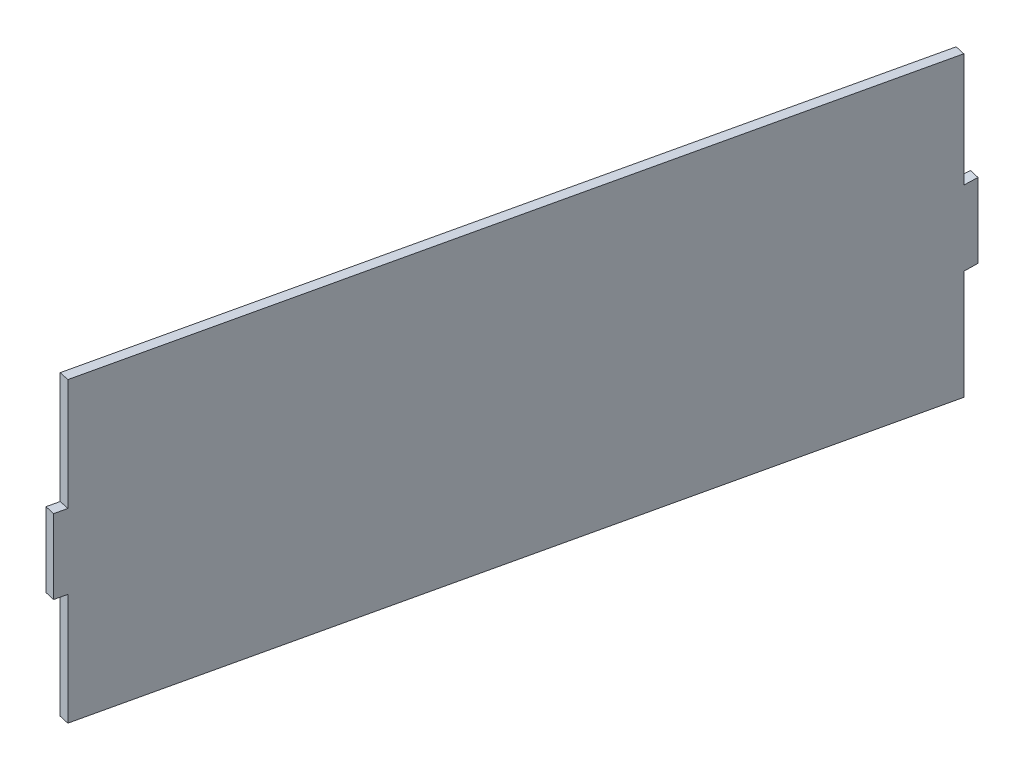
ISO-10303-21;
HEADER;
FILE_DESCRIPTION(('STEP AP214'),'2;1');
FILE_NAME('part.step','',(''),(''),'','','');
FILE_SCHEMA(('AUTOMOTIVE_DESIGN { 1 0 10303 214 1 1 1 1 }'));
ENDSEC;
DATA;
#1=APPLICATION_CONTEXT('core data for automotive mechanical design processes');
#2=APPLICATION_PROTOCOL_DEFINITION('international standard','automotive_design',2000,#1);
#3=PRODUCT_CONTEXT('',#1,'mechanical');
#4=PRODUCT('Part','Part','',(#3));
#5=PRODUCT_RELATED_PRODUCT_CATEGORY('part','',(#4));
#6=PRODUCT_DEFINITION_FORMATION('','',#4);
#7=PRODUCT_DEFINITION_CONTEXT('part definition',#1,'design');
#8=PRODUCT_DEFINITION('design','',#6,#7);
#9=PRODUCT_DEFINITION_SHAPE('','',#8);
#10=(LENGTH_UNIT() NAMED_UNIT(*) SI_UNIT(.MILLI.,.METRE.));
#11=(NAMED_UNIT(*) PLANE_ANGLE_UNIT() SI_UNIT($,.RADIAN.));
#12=(NAMED_UNIT(*) SI_UNIT($,.STERADIAN.) SOLID_ANGLE_UNIT());
#13=UNCERTAINTY_MEASURE_WITH_UNIT(LENGTH_MEASURE(1.E-05),#10,'distance_accuracy_value','');
#14=(GEOMETRIC_REPRESENTATION_CONTEXT(3) GLOBAL_UNCERTAINTY_ASSIGNED_CONTEXT((#13)) GLOBAL_UNIT_ASSIGNED_CONTEXT((#10,
#11,#12)) REPRESENTATION_CONTEXT('',''));
#15=CARTESIAN_POINT('',(0.,0.,0.));
#16=DIRECTION('',(0.,0.,1.));
#17=DIRECTION('',(1.,0.,0.));
#18=AXIS2_PLACEMENT_3D('',#15,#16,#17);
#19=CARTESIAN_POINT('',(242.285696399217,-154.081628831697,2778.09674090437));
#20=DIRECTION('',(0.,1.,0.));
#21=DIRECTION('',(-1.,0.,0.));
#22=AXIS2_PLACEMENT_3D('',#19,#20,#21);
#23=PLANE('',#22);
#24=DIRECTION('',(0.221396263565467,0.,-0.975183928538227));
#25=VECTOR('',#24,1.);
#26=CARTESIAN_POINT('',(252.193565113166,-154.081628831697,2780.34612694219));
#27=LINE('',#26,#25);
#28=CARTESIAN_POINT('',(249.53680995038,-154.081628831697,2792.04833408465));
#29=VERTEX_POINT('',#28);
#30=CARTESIAN_POINT('',(252.193565113166,-154.081628831697,2780.34612694219));
#31=VERTEX_POINT('',#30);
#32=EDGE_CURVE('E159',#29,#31,#27,.T.);
#33=ORIENTED_EDGE('',*,*,#32,.T.);
#34=DIRECTION('',(0.975183928538226,0.,0.221396263565471));
#35=VECTOR('',#34,1.);
#36=CARTESIAN_POINT('',(242.285696399217,-154.081628831697,2778.09674090437));
#37=LINE('',#36,#35);
#38=CARTESIAN_POINT('',(242.285696399217,-154.081628831697,2778.09674090437));
#39=VERTEX_POINT('',#38);
#40=EDGE_CURVE('E42',#39,#31,#37,.T.);
#41=ORIENTED_EDGE('',*,*,#40,.F.);
#42=DIRECTION('',(0.221396263565467,0.,-0.975183928538227));
#43=VECTOR('',#42,1.);
#44=CARTESIAN_POINT('',(242.285696399217,-154.081628831697,2778.09674090437));
#45=LINE('',#44,#43);
#46=CARTESIAN_POINT('',(239.628941236432,-154.081628831697,2789.79894804683));
#47=VERTEX_POINT('',#46);
#48=EDGE_CURVE('E180',#47,#39,#45,.T.);
#49=ORIENTED_EDGE('',*,*,#48,.F.);
#50=DIRECTION('',(0.975183928538226,0.,0.221396263565471));
#51=VECTOR('',#50,1.);
#52=CARTESIAN_POINT('',(239.628941236432,-154.081628831697,2789.79894804683));
#53=LINE('',#52,#51);
#54=EDGE_CURVE('E11',#47,#29,#53,.T.);
#55=ORIENTED_EDGE('',*,*,#54,.T.);
#56=EDGE_LOOP('',(#33,#41,#49,#55));
#57=FACE_BOUND('',#56,.T.);
#58=ADVANCED_FACE('F39',(#57),#23,.T.);
#59=CARTESIAN_POINT('',(239.628941236432,-154.081628831697,2789.79894804683));
#60=DIRECTION('',(-0.221396263565471,0.,0.975183928538226));
#61=DIRECTION('',(-0.975183928538226,0.,-0.221396263565471));
#62=AXIS2_PLACEMENT_3D('',#59,#60,#61);
#63=PLANE('',#62);
#64=DIRECTION('',(0.,1.,0.));
#65=VECTOR('',#64,1.);
#66=CARTESIAN_POINT('',(249.53680995038,-154.081628831697,2792.04833408465));
#67=LINE('',#66,#65);
#68=CARTESIAN_POINT('',(249.53680995038,-229.081628831698,2792.04833408465));
#69=VERTEX_POINT('',#68);
#70=EDGE_CURVE('E104',#69,#29,#67,.T.);
#71=ORIENTED_EDGE('',*,*,#70,.T.);
#72=ORIENTED_EDGE('',*,*,#54,.F.);
#73=DIRECTION('',(0.,1.,0.));
#74=VECTOR('',#73,1.);
#75=CARTESIAN_POINT('',(239.628941236432,-154.081628831697,2789.79894804683));
#76=LINE('',#75,#74);
#77=CARTESIAN_POINT('',(239.628941236432,-229.081628831698,2789.79894804683));
#78=VERTEX_POINT('',#77);
#79=EDGE_CURVE('E57',#78,#47,#76,.T.);
#80=ORIENTED_EDGE('',*,*,#79,.F.);
#81=DIRECTION('',(0.975183928538226,0.,0.221396263565471));
#82=VECTOR('',#81,1.);
#83=CARTESIAN_POINT('',(239.628941236432,-229.081628831698,2789.79894804683));
#84=LINE('',#83,#82);
#85=EDGE_CURVE('E48',#78,#69,#84,.T.);
#86=ORIENTED_EDGE('',*,*,#85,.T.);
#87=EDGE_LOOP('',(#71,#72,#80,#86));
#88=FACE_BOUND('',#87,.T.);
#89=ADVANCED_FACE('F265',(#88),#63,.T.);
#90=CARTESIAN_POINT('',(239.628941236432,-229.081628831698,2789.79894804683));
#91=DIRECTION('',(0.,-1.,0.));
#92=DIRECTION('',(1.,0.,0.));
#93=AXIS2_PLACEMENT_3D('',#90,#91,#92);
#94=PLANE('',#93);
#95=DIRECTION('',(-0.221396263565467,0.,0.975183928538227));
#96=VECTOR('',#95,1.);
#97=CARTESIAN_POINT('',(249.53680995038,-229.081628831698,2792.04833408465));
#98=LINE('',#97,#96);
#99=CARTESIAN_POINT('',(252.193565113166,-229.081628831698,2780.34612694219));
#100=VERTEX_POINT('',#99);
#101=EDGE_CURVE('E98',#100,#69,#98,.T.);
#102=ORIENTED_EDGE('',*,*,#101,.T.);
#103=ORIENTED_EDGE('',*,*,#85,.F.);
#104=DIRECTION('',(-0.221396263565467,0.,0.975183928538227));
#105=VECTOR('',#104,1.);
#106=CARTESIAN_POINT('',(239.628941236432,-229.081628831698,2789.79894804683));
#107=LINE('',#106,#105);
#108=CARTESIAN_POINT('',(242.285696399217,-229.081628831698,2778.09674090437));
#109=VERTEX_POINT('',#108);
#110=EDGE_CURVE('E141',#109,#78,#107,.T.);
#111=ORIENTED_EDGE('',*,*,#110,.F.);
#112=DIRECTION('',(0.975183928538226,0.,0.221396263565471));
#113=VECTOR('',#112,1.);
#114=CARTESIAN_POINT('',(242.285696399217,-229.081628831698,2778.09674090437));
#115=LINE('',#114,#113);
#116=EDGE_CURVE('E148',#109,#100,#115,.T.);
#117=ORIENTED_EDGE('',*,*,#116,.T.);
#118=EDGE_LOOP('',(#102,#103,#111,#117));
#119=FACE_BOUND('',#118,.T.);
#120=ADVANCED_FACE('F154',(#119),#94,.T.);
#121=CARTESIAN_POINT('',(242.285696399217,-229.081628831698,2778.09674090437));
#122=DIRECTION('',(-0.221396263565471,0.,0.975183928538226));
#123=DIRECTION('',(-0.975183928538226,0.,-0.221396263565471));
#124=AXIS2_PLACEMENT_3D('',#121,#122,#123);
#125=PLANE('',#124);
#126=DIRECTION('',(0.,1.,0.));
#127=VECTOR('',#126,1.);
#128=CARTESIAN_POINT('',(252.193565113166,-229.081628831698,2780.34612694219));
#129=LINE('',#128,#127);
#130=CARTESIAN_POINT('',(252.193565113166,-341.581628831697,2780.34612694219));
#131=VERTEX_POINT('',#130);
#132=EDGE_CURVE('E151',#131,#100,#129,.T.);
#133=ORIENTED_EDGE('',*,*,#132,.T.);
#134=ORIENTED_EDGE('',*,*,#116,.F.);
#135=DIRECTION('',(0.,1.,0.));
#136=VECTOR('',#135,1.);
#137=CARTESIAN_POINT('',(242.285696399217,-229.081628831698,2778.09674090437));
#138=LINE('',#137,#136);
#139=CARTESIAN_POINT('',(242.285696399217,-341.581628831697,2778.09674090437));
#140=VERTEX_POINT('',#139);
#141=EDGE_CURVE('E137',#140,#109,#138,.T.);
#142=ORIENTED_EDGE('',*,*,#141,.F.);
#143=DIRECTION('',(0.975183928538226,0.,0.221396263565471));
#144=VECTOR('',#143,1.);
#145=CARTESIAN_POINT('',(242.285696399217,-341.581628831697,2778.09674090437));
#146=LINE('',#145,#144);
#147=EDGE_CURVE('E152',#140,#131,#146,.T.);
#148=ORIENTED_EDGE('',*,*,#147,.T.);
#149=EDGE_LOOP('',(#133,#134,#142,#148));
#150=FACE_BOUND('',#149,.T.);
#151=ADVANCED_FACE('F149',(#150),#125,.T.);
#152=CARTESIAN_POINT('',(242.285696399217,-341.581628831697,2778.09674090437));
#153=DIRECTION('',(0.,-1.,0.));
#154=DIRECTION('',(1.,0.,0.));
#155=AXIS2_PLACEMENT_3D('',#152,#153,#154);
#156=PLANE('',#155);
#157=DIRECTION('',(-0.221396263565472,0.,0.975183928538226));
#158=VECTOR('',#157,1.);
#159=CARTESIAN_POINT('',(252.193565113166,-341.581628831697,2780.34612694219));
#160=LINE('',#159,#158);
#161=CARTESIAN_POINT('',(419.310148463061,-341.581628831697,2044.24785838743));
#162=VERTEX_POINT('',#161);
#163=EDGE_CURVE('E176',#162,#131,#160,.T.);
#164=ORIENTED_EDGE('',*,*,#163,.T.);
#165=ORIENTED_EDGE('',*,*,#147,.F.);
#166=DIRECTION('',(-0.221396263565472,0.,0.975183928538226));
#167=VECTOR('',#166,1.);
#168=CARTESIAN_POINT('',(242.285696399217,-341.581628831697,2778.09674090437));
#169=LINE('',#168,#167);
#170=CARTESIAN_POINT('',(409.402279749113,-341.581628831697,2041.99847234961));
#171=VERTEX_POINT('',#170);
#172=EDGE_CURVE('E143',#171,#140,#169,.T.);
#173=ORIENTED_EDGE('',*,*,#172,.F.);
#174=DIRECTION('',(0.975183928538226,0.,0.221396263565471));
#175=VECTOR('',#174,1.);
#176=CARTESIAN_POINT('',(409.402279749113,-341.581628831697,2041.99847234961));
#177=LINE('',#176,#175);
#178=EDGE_CURVE('E184',#171,#162,#177,.T.);
#179=ORIENTED_EDGE('',*,*,#178,.T.);
#180=EDGE_LOOP('',(#164,#165,#173,#179));
#181=FACE_BOUND('',#180,.T.);
#182=ADVANCED_FACE('F244',(#181),#156,.T.);
#183=CARTESIAN_POINT('',(409.402279749113,-231.512401326091,2041.99847234961));
#184=DIRECTION('',(0.221396263565471,0.,-0.975183928538226));
#185=DIRECTION('',(0.975183928538226,0.,0.221396263565471));
#186=AXIS2_PLACEMENT_3D('',#183,#184,#185);
#187=PLANE('',#186);
#188=DIRECTION('',(0.,-1.,0.));
#189=VECTOR('',#188,1.);
#190=CARTESIAN_POINT('',(419.310148463061,-231.512401326091,2044.24785838743));
#191=LINE('',#190,#189);
#192=CARTESIAN_POINT('',(419.310148463061,-231.512401326091,2044.24785838743));
#193=VERTEX_POINT('',#192);
#194=EDGE_CURVE('E174',#193,#162,#191,.T.);
#195=ORIENTED_EDGE('',*,*,#194,.T.);
#196=ORIENTED_EDGE('',*,*,#178,.F.);
#197=DIRECTION('',(0.,-1.,0.));
#198=VECTOR('',#197,1.);
#199=CARTESIAN_POINT('',(409.402279749113,-231.512401326091,2041.99847234961));
#200=LINE('',#199,#198);
#201=CARTESIAN_POINT('',(409.402279749113,-231.512401326091,2041.99847234961));
#202=VERTEX_POINT('',#201);
#203=EDGE_CURVE('E234',#202,#171,#200,.T.);
#204=ORIENTED_EDGE('',*,*,#203,.F.);
#205=DIRECTION('',(0.975183928538226,0.,0.221396263565471));
#206=VECTOR('',#205,1.);
#207=CARTESIAN_POINT('',(409.402279749113,-231.512401326091,2041.99847234961));
#208=LINE('',#207,#206);
#209=EDGE_CURVE('E187',#202,#193,#208,.T.);
#210=ORIENTED_EDGE('',*,*,#209,.T.);
#211=EDGE_LOOP('',(#195,#196,#204,#210));
#212=FACE_BOUND('',#211,.T.);
#213=ADVANCED_FACE('F240',(#212),#187,.T.);
#214=CARTESIAN_POINT('',(412.059034911898,-229.081628831698,2030.29626520715));
#215=DIRECTION('',(0.0439542877366629,-0.980094365221815,-0.193605412760103));
#216=DIRECTION('',(0.,-0.193792705023036,0.981042500343311));
#217=AXIS2_PLACEMENT_3D('',#214,#215,#216);
#218=PLANE('',#217);
#219=DIRECTION('',(-0.216989230401686,-0.198532202074241,0.955772273415188));
#220=VECTOR('',#219,1.);
#221=CARTESIAN_POINT('',(421.966903625847,-229.081628831698,2032.54565124498));
#222=LINE('',#221,#220);
#223=CARTESIAN_POINT('',(421.966903625847,-229.081628831698,2032.54565124498));
#224=VERTEX_POINT('',#223);
#225=EDGE_CURVE('E172',#224,#193,#222,.T.);
#226=ORIENTED_EDGE('',*,*,#225,.T.);
#227=ORIENTED_EDGE('',*,*,#209,.F.);
#228=DIRECTION('',(-0.216989230401686,-0.198532202074241,0.955772273415188));
#229=VECTOR('',#228,1.);
#230=CARTESIAN_POINT('',(412.059034911898,-229.081628831698,2030.29626520715));
#231=LINE('',#230,#229);
#232=CARTESIAN_POINT('',(412.059034911898,-229.081628831698,2030.29626520715));
#233=VERTEX_POINT('',#232);
#234=EDGE_CURVE('E232',#233,#202,#231,.T.);
#235=ORIENTED_EDGE('',*,*,#234,.F.);
#236=DIRECTION('',(0.975183928538226,0.,0.221396263565471));
#237=VECTOR('',#236,1.);
#238=CARTESIAN_POINT('',(412.059034911898,-229.081628831698,2030.29626520715));
#239=LINE('',#238,#237);
#240=EDGE_CURVE('E190',#233,#224,#239,.T.);
#241=ORIENTED_EDGE('',*,*,#240,.T.);
#242=EDGE_LOOP('',(#226,#227,#235,#241));
#243=FACE_BOUND('',#242,.T.);
#244=ADVANCED_FACE('F248',(#243),#218,.T.);
#245=CARTESIAN_POINT('',(412.059034911898,-154.081628831697,2030.29626520715));
#246=DIRECTION('',(0.221396263565471,0.,-0.975183928538226));
#247=DIRECTION('',(0.975183928538226,0.,0.221396263565471));
#248=AXIS2_PLACEMENT_3D('',#245,#246,#247);
#249=PLANE('',#248);
#250=DIRECTION('',(0.,-1.,0.));
#251=VECTOR('',#250,1.);
#252=CARTESIAN_POINT('',(421.966903625847,-154.081628831697,2032.54565124498));
#253=LINE('',#252,#251);
#254=CARTESIAN_POINT('',(421.966903625847,-154.081628831697,2032.54565124498));
#255=VERTEX_POINT('',#254);
#256=EDGE_CURVE('E170',#255,#224,#253,.T.);
#257=ORIENTED_EDGE('',*,*,#256,.T.);
#258=ORIENTED_EDGE('',*,*,#240,.F.);
#259=DIRECTION('',(0.,-1.,0.));
#260=VECTOR('',#259,1.);
#261=CARTESIAN_POINT('',(412.059034911898,-154.081628831697,2030.29626520715));
#262=LINE('',#261,#260);
#263=CARTESIAN_POINT('',(412.059034911898,-154.081628831697,2030.29626520715));
#264=VERTEX_POINT('',#263);
#265=EDGE_CURVE('E226',#264,#233,#262,.T.);
#266=ORIENTED_EDGE('',*,*,#265,.F.);
#267=DIRECTION('',(0.975183928538226,0.,0.221396263565471));
#268=VECTOR('',#267,1.);
#269=CARTESIAN_POINT('',(412.059034911898,-154.081628831697,2030.29626520715));
#270=LINE('',#269,#268);
#271=EDGE_CURVE('E193',#264,#255,#270,.T.);
#272=ORIENTED_EDGE('',*,*,#271,.T.);
#273=EDGE_LOOP('',(#257,#258,#266,#272));
#274=FACE_BOUND('',#273,.T.);
#275=ADVANCED_FACE('F252',(#274),#249,.T.);
#276=CARTESIAN_POINT('',(412.059034911898,-154.081628831697,2030.29626520715));
#277=DIRECTION('',(-0.0394416530548302,0.984003416879623,0.173728614722877));
#278=DIRECTION('',(0.,0.173863902526287,-0.98476969053598));
#279=AXIS2_PLACEMENT_3D('',#276,#277,#278);
#280=PLANE('',#279);
#281=DIRECTION('',(0.217854679832809,0.178149587620144,-0.959584317767707));
#282=VECTOR('',#281,1.);
#283=CARTESIAN_POINT('',(421.966903625847,-154.081628831697,2032.54565124498));
#284=LINE('',#283,#282);
#285=CARTESIAN_POINT('',(419.310148463061,-156.254177234243,2044.24785838743));
#286=VERTEX_POINT('',#285);
#287=EDGE_CURVE('E168',#286,#255,#284,.T.);
#288=ORIENTED_EDGE('',*,*,#287,.T.);
#289=ORIENTED_EDGE('',*,*,#271,.F.);
#290=DIRECTION('',(0.217854679832809,0.178149587620144,-0.959584317767707));
#291=VECTOR('',#290,1.);
#292=CARTESIAN_POINT('',(412.059034911898,-154.081628831697,2030.29626520715));
#293=LINE('',#292,#291);
#294=CARTESIAN_POINT('',(409.402279749113,-156.254177234243,2041.99847234961));
#295=VERTEX_POINT('',#294);
#296=EDGE_CURVE('E223',#295,#264,#293,.T.);
#297=ORIENTED_EDGE('',*,*,#296,.F.);
#298=DIRECTION('',(0.975183928538226,0.,0.221396263565471));
#299=VECTOR('',#298,1.);
#300=CARTESIAN_POINT('',(409.402279749113,-156.254177234243,2041.99847234961));
#301=LINE('',#300,#299);
#302=EDGE_CURVE('E196',#295,#286,#301,.T.);
#303=ORIENTED_EDGE('',*,*,#302,.T.);
#304=EDGE_LOOP('',(#288,#289,#297,#303));
#305=FACE_BOUND('',#304,.T.);
#306=ADVANCED_FACE('F255',(#305),#280,.T.);
#307=CARTESIAN_POINT('',(409.402279749113,-41.5816288316975,2041.99847234961));
#308=DIRECTION('',(0.221396263565471,0.,-0.975183928538226));
#309=DIRECTION('',(0.975183928538226,0.,0.221396263565471));
#310=AXIS2_PLACEMENT_3D('',#307,#308,#309);
#311=PLANE('',#310);
#312=DIRECTION('',(0.,-1.,0.));
#313=VECTOR('',#312,1.);
#314=CARTESIAN_POINT('',(419.310148463061,-41.5816288316975,2044.24785838743));
#315=LINE('',#314,#313);
#316=CARTESIAN_POINT('',(419.310148463061,-41.5816288316975,2044.24785838743));
#317=VERTEX_POINT('',#316);
#318=EDGE_CURVE('E166',#317,#286,#315,.T.);
#319=ORIENTED_EDGE('',*,*,#318,.T.);
#320=ORIENTED_EDGE('',*,*,#302,.F.);
#321=DIRECTION('',(0.,-1.,0.));
#322=VECTOR('',#321,1.);
#323=CARTESIAN_POINT('',(409.402279749113,-41.5816288316975,2041.99847234961));
#324=LINE('',#323,#322);
#325=CARTESIAN_POINT('',(409.402279749113,-41.5816288316975,2041.99847234961));
#326=VERTEX_POINT('',#325);
#327=EDGE_CURVE('E221',#326,#295,#324,.T.);
#328=ORIENTED_EDGE('',*,*,#327,.F.);
#329=DIRECTION('',(0.975183928538226,0.,0.221396263565471));
#330=VECTOR('',#329,1.);
#331=CARTESIAN_POINT('',(409.402279749113,-41.5816288316975,2041.99847234961));
#332=LINE('',#331,#330);
#333=EDGE_CURVE('E199',#326,#317,#332,.T.);
#334=ORIENTED_EDGE('',*,*,#333,.T.);
#335=EDGE_LOOP('',(#319,#320,#328,#334));
#336=FACE_BOUND('',#335,.T.);
#337=ADVANCED_FACE('F219',(#336),#311,.T.);
#338=CARTESIAN_POINT('',(242.285696399217,-41.5816288316974,2778.09674090437));
#339=DIRECTION('',(0.,1.,0.));
#340=DIRECTION('',(-1.,0.,0.));
#341=AXIS2_PLACEMENT_3D('',#338,#339,#340);
#342=PLANE('',#341);
#343=DIRECTION('',(0.221396263565472,0.,-0.975183928538226));
#344=VECTOR('',#343,1.);
#345=CARTESIAN_POINT('',(252.193565113165,-41.5816288316974,2780.34612694219));
#346=LINE('',#345,#344);
#347=CARTESIAN_POINT('',(252.193565113165,-41.5816288316974,2780.34612694219));
#348=VERTEX_POINT('',#347);
#349=EDGE_CURVE('E164',#348,#317,#346,.T.);
#350=ORIENTED_EDGE('',*,*,#349,.T.);
#351=ORIENTED_EDGE('',*,*,#333,.F.);
#352=DIRECTION('',(0.221396263565472,0.,-0.975183928538226));
#353=VECTOR('',#352,1.);
#354=CARTESIAN_POINT('',(242.285696399217,-41.5816288316974,2778.09674090437));
#355=LINE('',#354,#353);
#356=CARTESIAN_POINT('',(242.285696399217,-41.5816288316974,2778.09674090437));
#357=VERTEX_POINT('',#356);
#358=EDGE_CURVE('E224',#357,#326,#355,.T.);
#359=ORIENTED_EDGE('',*,*,#358,.F.);
#360=DIRECTION('',(0.975183928538226,0.,0.221396263565471));
#361=VECTOR('',#360,1.);
#362=CARTESIAN_POINT('',(242.285696399217,-41.5816288316974,2778.09674090437));
#363=LINE('',#362,#361);
#364=EDGE_CURVE('E201',#357,#348,#363,.T.);
#365=ORIENTED_EDGE('',*,*,#364,.T.);
#366=EDGE_LOOP('',(#350,#351,#359,#365));
#367=FACE_BOUND('',#366,.T.);
#368=ADVANCED_FACE('F216',(#367),#342,.T.);
#369=CARTESIAN_POINT('',(242.285696399217,-41.5816288316974,2778.09674090437));
#370=DIRECTION('',(-0.221396263565471,0.,0.975183928538226));
#371=DIRECTION('',(-0.975183928538226,0.,-0.221396263565471));
#372=AXIS2_PLACEMENT_3D('',#369,#370,#371);
#373=PLANE('',#372);
#374=DIRECTION('',(0.,1.,0.));
#375=VECTOR('',#374,1.);
#376=CARTESIAN_POINT('',(252.193565113165,-41.5816288316974,2780.34612694219));
#377=LINE('',#376,#375);
#378=EDGE_CURVE('E162',#31,#348,#377,.T.);
#379=ORIENTED_EDGE('',*,*,#378,.T.);
#380=ORIENTED_EDGE('',*,*,#364,.F.);
#381=DIRECTION('',(0.,1.,0.));
#382=VECTOR('',#381,1.);
#383=CARTESIAN_POINT('',(242.285696399217,-41.5816288316974,2778.09674090437));
#384=LINE('',#383,#382);
#385=EDGE_CURVE('E112',#39,#357,#384,.T.);
#386=ORIENTED_EDGE('',*,*,#385,.F.);
#387=ORIENTED_EDGE('',*,*,#40,.T.);
#388=EDGE_LOOP('',(#379,#380,#386,#387));
#389=FACE_BOUND('',#388,.T.);
#390=ADVANCED_FACE('F207',(#389),#373,.T.);
#391=CARTESIAN_POINT('',(830.206606114888,1.23609915892171E-12,188.482023956979));
#392=DIRECTION('',(-0.975183928538227,0.,-0.221396263565467));
#393=DIRECTION('',(0.221396263565467,0.,-0.975183928538227));
#394=AXIS2_PLACEMENT_3D('',#391,#392,#393);
#395=PLANE('',#394);
#396=ORIENTED_EDGE('',*,*,#48,.T.);
#397=ORIENTED_EDGE('',*,*,#385,.T.);
#398=ORIENTED_EDGE('',*,*,#358,.T.);
#399=ORIENTED_EDGE('',*,*,#327,.T.);
#400=ORIENTED_EDGE('',*,*,#296,.T.);
#401=ORIENTED_EDGE('',*,*,#265,.T.);
#402=ORIENTED_EDGE('',*,*,#234,.T.);
#403=ORIENTED_EDGE('',*,*,#203,.T.);
#404=ORIENTED_EDGE('',*,*,#172,.T.);
#405=ORIENTED_EDGE('',*,*,#141,.T.);
#406=ORIENTED_EDGE('',*,*,#110,.T.);
#407=ORIENTED_EDGE('',*,*,#79,.T.);
#408=EDGE_LOOP('',(#396,#397,#398,#399,#400,#401,#402,#403,#404,#405,#406,#407));
#409=FACE_BOUND('',#408,.T.);
#410=ADVANCED_FACE('F139',(#409),#395,.T.);
#411=CARTESIAN_POINT('',(840.114474828836,1.24361924436779E-12,190.731409994805));
#412=DIRECTION('',(-0.975183928538227,0.,-0.221396263565467));
#413=DIRECTION('',(0.221396263565467,0.,-0.975183928538227));
#414=AXIS2_PLACEMENT_3D('',#411,#412,#413);
#415=PLANE('',#414);
#416=ORIENTED_EDGE('',*,*,#32,.F.);
#417=ORIENTED_EDGE('',*,*,#70,.F.);
#418=ORIENTED_EDGE('',*,*,#101,.F.);
#419=ORIENTED_EDGE('',*,*,#132,.F.);
#420=ORIENTED_EDGE('',*,*,#163,.F.);
#421=ORIENTED_EDGE('',*,*,#194,.F.);
#422=ORIENTED_EDGE('',*,*,#225,.F.);
#423=ORIENTED_EDGE('',*,*,#256,.F.);
#424=ORIENTED_EDGE('',*,*,#287,.F.);
#425=ORIENTED_EDGE('',*,*,#318,.F.);
#426=ORIENTED_EDGE('',*,*,#349,.F.);
#427=ORIENTED_EDGE('',*,*,#378,.F.);
#428=EDGE_LOOP('',(#416,#417,#418,#419,#420,#421,#422,#423,#424,#425,#426,#427));
#429=FACE_BOUND('',#428,.T.);
#430=ADVANCED_FACE('F212',(#429),#415,.F.);
#431=CLOSED_SHELL('',(#58,#89,#120,#151,#182,#213,#244,#275,#306,#337,#368,#390,#410,#430));
#432=MANIFOLD_SOLID_BREP('B2',#431);
#433=ADVANCED_BREP_SHAPE_REPRESENTATION('',(#18,#432),#14);
#434=SHAPE_DEFINITION_REPRESENTATION(#9,#433);
ENDSEC;
END-ISO-10303-21;
